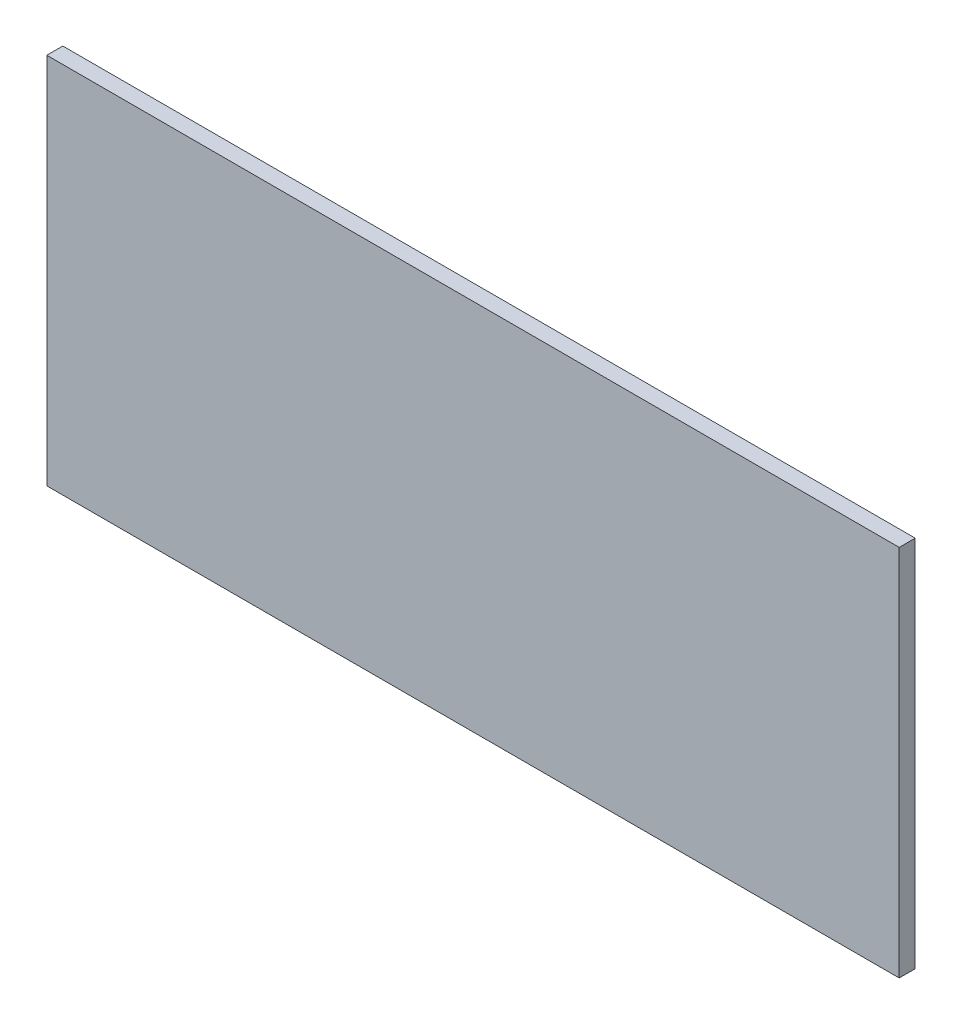
ISO-10303-21;
HEADER;
FILE_DESCRIPTION(('STEP AP214'),'2;1');
FILE_NAME('part.step','',(''),(''),'','','');
FILE_SCHEMA(('AUTOMOTIVE_DESIGN { 1 0 10303 214 1 1 1 1 }'));
ENDSEC;
DATA;
#1=APPLICATION_CONTEXT('core data for automotive mechanical design processes');
#2=APPLICATION_PROTOCOL_DEFINITION('international standard','automotive_design',2000,#1);
#3=PRODUCT_CONTEXT('',#1,'mechanical');
#4=PRODUCT('Part','Part','',(#3));
#5=PRODUCT_RELATED_PRODUCT_CATEGORY('part','',(#4));
#6=PRODUCT_DEFINITION_FORMATION('','',#4);
#7=PRODUCT_DEFINITION_CONTEXT('part definition',#1,'design');
#8=PRODUCT_DEFINITION('design','',#6,#7);
#9=PRODUCT_DEFINITION_SHAPE('','',#8);
#10=(LENGTH_UNIT() NAMED_UNIT(*) SI_UNIT(.MILLI.,.METRE.));
#11=(NAMED_UNIT(*) PLANE_ANGLE_UNIT() SI_UNIT($,.RADIAN.));
#12=(NAMED_UNIT(*) SI_UNIT($,.STERADIAN.) SOLID_ANGLE_UNIT());
#13=UNCERTAINTY_MEASURE_WITH_UNIT(LENGTH_MEASURE(1.E-05),#10,'distance_accuracy_value','');
#14=(GEOMETRIC_REPRESENTATION_CONTEXT(3) GLOBAL_UNCERTAINTY_ASSIGNED_CONTEXT((#13)) GLOBAL_UNIT_ASSIGNED_CONTEXT((#10,
#11,#12)) REPRESENTATION_CONTEXT('',''));
#15=CARTESIAN_POINT('',(0.,0.,0.));
#16=DIRECTION('',(0.,0.,1.));
#17=DIRECTION('',(1.,0.,0.));
#18=AXIS2_PLACEMENT_3D('',#15,#16,#17);
#19=CARTESIAN_POINT('',(-160.,0.,3.));
#20=DIRECTION('',(0.,1.,0.));
#21=DIRECTION('',(0.,0.,1.));
#22=AXIS2_PLACEMENT_3D('',#19,#20,#21);
#23=PLANE('',#22);
#24=DIRECTION('',(1.,0.,0.));
#25=VECTOR('',#24,1.);
#26=CARTESIAN_POINT('',(-160.,0.,0.));
#27=LINE('',#26,#25);
#28=CARTESIAN_POINT('',(-160.,0.,0.));
#29=VERTEX_POINT('',#28);
#30=CARTESIAN_POINT('',(0.,0.,0.));
#31=VERTEX_POINT('',#30);
#32=EDGE_CURVE('E96',#29,#31,#27,.T.);
#33=ORIENTED_EDGE('',*,*,#32,.T.);
#34=DIRECTION('',(0.,0.,-1.));
#35=VECTOR('',#34,1.);
#36=CARTESIAN_POINT('',(0.,0.,3.));
#37=LINE('',#36,#35);
#38=CARTESIAN_POINT('',(0.,0.,3.));
#39=VERTEX_POINT('',#38);
#40=EDGE_CURVE('E11',#39,#31,#37,.T.);
#41=ORIENTED_EDGE('',*,*,#40,.F.);
#42=DIRECTION('',(1.,0.,0.));
#43=VECTOR('',#42,1.);
#44=CARTESIAN_POINT('',(-160.,0.,3.));
#45=LINE('',#44,#43);
#46=CARTESIAN_POINT('',(-160.,0.,3.));
#47=VERTEX_POINT('',#46);
#48=EDGE_CURVE('E84',#47,#39,#45,.T.);
#49=ORIENTED_EDGE('',*,*,#48,.F.);
#50=DIRECTION('',(0.,0.,-1.));
#51=VECTOR('',#50,1.);
#52=CARTESIAN_POINT('',(-160.,0.,3.));
#53=LINE('',#52,#51);
#54=EDGE_CURVE('E92',#47,#29,#53,.T.);
#55=ORIENTED_EDGE('',*,*,#54,.T.);
#56=EDGE_LOOP('',(#33,#41,#49,#55));
#57=FACE_BOUND('',#56,.T.);
#58=ADVANCED_FACE('F33',(#57),#23,.F.);
#59=CARTESIAN_POINT('',(0.,0.,3.));
#60=DIRECTION('',(-1.,0.,0.));
#61=DIRECTION('',(0.,0.,1.));
#62=AXIS2_PLACEMENT_3D('',#59,#60,#61);
#63=PLANE('',#62);
#64=DIRECTION('',(0.,1.,0.));
#65=VECTOR('',#64,1.);
#66=CARTESIAN_POINT('',(0.,0.,0.));
#67=LINE('',#66,#65);
#68=CARTESIAN_POINT('',(0.,70.,0.));
#69=VERTEX_POINT('',#68);
#70=EDGE_CURVE('E88',#31,#69,#67,.T.);
#71=ORIENTED_EDGE('',*,*,#70,.T.);
#72=DIRECTION('',(0.,0.,-1.));
#73=VECTOR('',#72,1.);
#74=CARTESIAN_POINT('',(0.,70.,3.));
#75=LINE('',#74,#73);
#76=CARTESIAN_POINT('',(0.,70.,3.));
#77=VERTEX_POINT('',#76);
#78=EDGE_CURVE('E41',#77,#69,#75,.T.);
#79=ORIENTED_EDGE('',*,*,#78,.F.);
#80=DIRECTION('',(0.,1.,0.));
#81=VECTOR('',#80,1.);
#82=CARTESIAN_POINT('',(0.,0.,3.));
#83=LINE('',#82,#81);
#84=EDGE_CURVE('E79',#39,#77,#83,.T.);
#85=ORIENTED_EDGE('',*,*,#84,.F.);
#86=ORIENTED_EDGE('',*,*,#40,.T.);
#87=EDGE_LOOP('',(#71,#79,#85,#86));
#88=FACE_BOUND('',#87,.T.);
#89=ADVANCED_FACE('F87',(#88),#63,.F.);
#90=CARTESIAN_POINT('',(0.,70.,3.));
#91=DIRECTION('',(0.,-1.,0.));
#92=DIRECTION('',(1.,0.,0.));
#93=AXIS2_PLACEMENT_3D('',#90,#91,#92);
#94=PLANE('',#93);
#95=DIRECTION('',(-1.,0.,0.));
#96=VECTOR('',#95,1.);
#97=CARTESIAN_POINT('',(0.,70.,0.));
#98=LINE('',#97,#96);
#99=CARTESIAN_POINT('',(-160.,69.9999999999989,0.));
#100=VERTEX_POINT('',#99);
#101=EDGE_CURVE('E66',#69,#100,#98,.T.);
#102=ORIENTED_EDGE('',*,*,#101,.T.);
#103=DIRECTION('',(0.,0.,-1.));
#104=VECTOR('',#103,1.);
#105=CARTESIAN_POINT('',(-160.,69.9999999999989,3.));
#106=LINE('',#105,#104);
#107=CARTESIAN_POINT('',(-160.,69.9999999999989,3.));
#108=VERTEX_POINT('',#107);
#109=EDGE_CURVE('E89',#108,#100,#106,.T.);
#110=ORIENTED_EDGE('',*,*,#109,.F.);
#111=DIRECTION('',(-1.,0.,0.));
#112=VECTOR('',#111,1.);
#113=CARTESIAN_POINT('',(0.,70.,3.));
#114=LINE('',#113,#112);
#115=EDGE_CURVE('E82',#77,#108,#114,.T.);
#116=ORIENTED_EDGE('',*,*,#115,.F.);
#117=ORIENTED_EDGE('',*,*,#78,.T.);
#118=EDGE_LOOP('',(#102,#110,#116,#117));
#119=FACE_BOUND('',#118,.T.);
#120=ADVANCED_FACE('F90',(#119),#94,.F.);
#121=CARTESIAN_POINT('',(-160.,69.9999999999989,3.));
#122=DIRECTION('',(1.,0.,0.));
#123=DIRECTION('',(0.,0.,-1.));
#124=AXIS2_PLACEMENT_3D('',#121,#122,#123);
#125=PLANE('',#124);
#126=DIRECTION('',(0.,-1.,0.));
#127=VECTOR('',#126,1.);
#128=CARTESIAN_POINT('',(-160.,69.9999999999989,0.));
#129=LINE('',#128,#127);
#130=EDGE_CURVE('E72',#100,#29,#129,.T.);
#131=ORIENTED_EDGE('',*,*,#130,.T.);
#132=ORIENTED_EDGE('',*,*,#54,.F.);
#133=DIRECTION('',(0.,-1.,0.));
#134=VECTOR('',#133,1.);
#135=CARTESIAN_POINT('',(-160.,69.9999999999989,3.));
#136=LINE('',#135,#134);
#137=EDGE_CURVE('E49',#108,#47,#136,.T.);
#138=ORIENTED_EDGE('',*,*,#137,.F.);
#139=ORIENTED_EDGE('',*,*,#109,.T.);
#140=EDGE_LOOP('',(#131,#132,#138,#139));
#141=FACE_BOUND('',#140,.T.);
#142=ADVANCED_FACE('F103',(#141),#125,.F.);
#143=CARTESIAN_POINT('',(0.,0.,3.));
#144=DIRECTION('',(0.,0.,1.));
#145=DIRECTION('',(1.,0.,0.));
#146=AXIS2_PLACEMENT_3D('',#143,#144,#145);
#147=PLANE('',#146);
#148=ORIENTED_EDGE('',*,*,#48,.T.);
#149=ORIENTED_EDGE('',*,*,#84,.T.);
#150=ORIENTED_EDGE('',*,*,#115,.T.);
#151=ORIENTED_EDGE('',*,*,#137,.T.);
#152=EDGE_LOOP('',(#148,#149,#150,#151));
#153=FACE_BOUND('',#152,.T.);
#154=ADVANCED_FACE('F80',(#153),#147,.T.);
#155=CARTESIAN_POINT('',(0.,0.,0.));
#156=DIRECTION('',(0.,0.,1.));
#157=DIRECTION('',(1.,0.,0.));
#158=AXIS2_PLACEMENT_3D('',#155,#156,#157);
#159=PLANE('',#158);
#160=ORIENTED_EDGE('',*,*,#32,.F.);
#161=ORIENTED_EDGE('',*,*,#130,.F.);
#162=ORIENTED_EDGE('',*,*,#101,.F.);
#163=ORIENTED_EDGE('',*,*,#70,.F.);
#164=EDGE_LOOP('',(#160,#161,#162,#163));
#165=FACE_BOUND('',#164,.T.);
#166=ADVANCED_FACE('F106',(#165),#159,.F.);
#167=CLOSED_SHELL('',(#58,#89,#120,#142,#154,#166));
#168=MANIFOLD_SOLID_BREP('B2',#167);
#169=ADVANCED_BREP_SHAPE_REPRESENTATION('',(#18,#168),#14);
#170=SHAPE_DEFINITION_REPRESENTATION(#9,#169);
ENDSEC;
END-ISO-10303-21;
